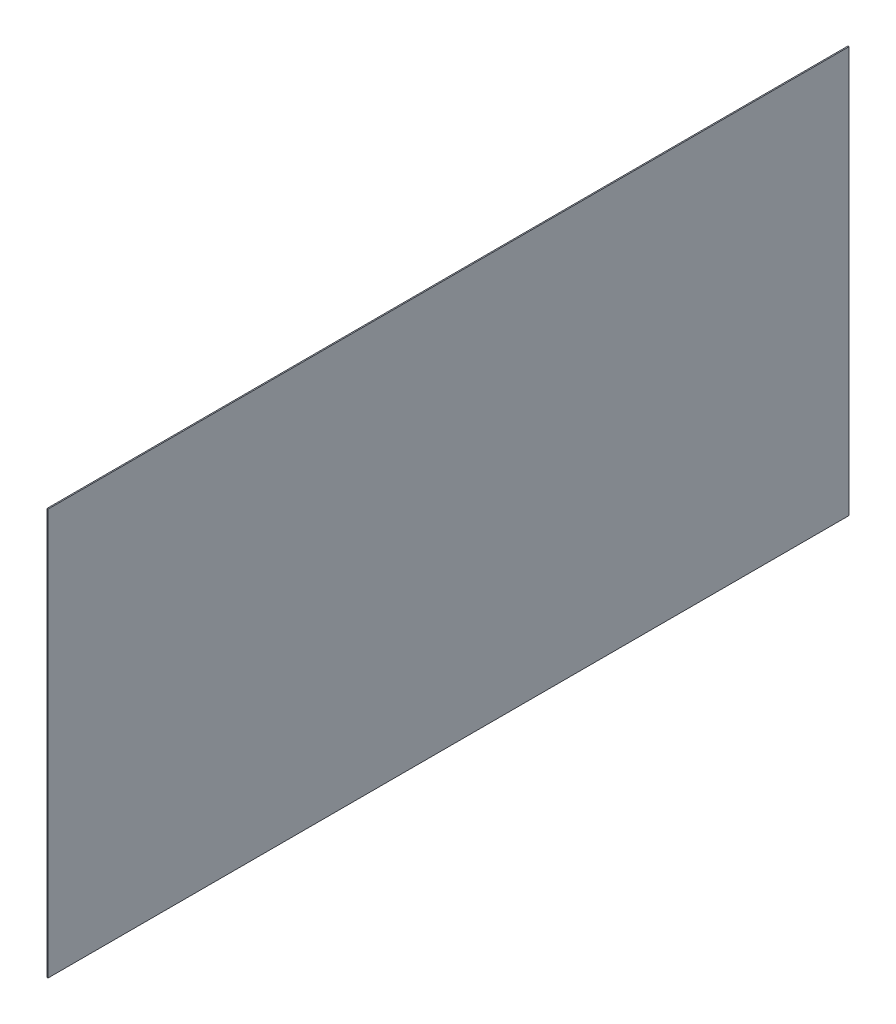
ISO-10303-21;
HEADER;
FILE_DESCRIPTION(('STEP AP214'),'2;1');
FILE_NAME('part.step','',(''),(''),'','','');
FILE_SCHEMA(('AUTOMOTIVE_DESIGN { 1 0 10303 214 1 1 1 1 }'));
ENDSEC;
DATA;
#1=APPLICATION_CONTEXT('core data for automotive mechanical design processes');
#2=APPLICATION_PROTOCOL_DEFINITION('international standard','automotive_design',2000,#1);
#3=PRODUCT_CONTEXT('',#1,'mechanical');
#4=PRODUCT('Part','Part','',(#3));
#5=PRODUCT_RELATED_PRODUCT_CATEGORY('part','',(#4));
#6=PRODUCT_DEFINITION_FORMATION('','',#4);
#7=PRODUCT_DEFINITION_CONTEXT('part definition',#1,'design');
#8=PRODUCT_DEFINITION('design','',#6,#7);
#9=PRODUCT_DEFINITION_SHAPE('','',#8);
#10=(LENGTH_UNIT() NAMED_UNIT(*) SI_UNIT(.MILLI.,.METRE.));
#11=(NAMED_UNIT(*) PLANE_ANGLE_UNIT() SI_UNIT($,.RADIAN.));
#12=(NAMED_UNIT(*) SI_UNIT($,.STERADIAN.) SOLID_ANGLE_UNIT());
#13=UNCERTAINTY_MEASURE_WITH_UNIT(LENGTH_MEASURE(1.E-05),#10,'distance_accuracy_value','');
#14=(GEOMETRIC_REPRESENTATION_CONTEXT(3) GLOBAL_UNCERTAINTY_ASSIGNED_CONTEXT((#13)) GLOBAL_UNIT_ASSIGNED_CONTEXT((#10,
#11,#12)) REPRESENTATION_CONTEXT('',''));
#15=CARTESIAN_POINT('',(0.,0.,0.));
#16=DIRECTION('',(0.,0.,1.));
#17=DIRECTION('',(1.,0.,0.));
#18=AXIS2_PLACEMENT_3D('',#15,#16,#17);
#19=CARTESIAN_POINT('',(-125.2,-60.,150.));
#20=DIRECTION('',(0.,-1.,0.));
#21=DIRECTION('',(0.,0.,-1.));
#22=AXIS2_PLACEMENT_3D('',#19,#20,#21);
#23=PLANE('',#22);
#24=DIRECTION('',(1.,0.,0.));
#25=VECTOR('',#24,1.);
#26=CARTESIAN_POINT('',(-135.,-60.,-71.));
#27=LINE('',#26,#25);
#28=CARTESIAN_POINT('',(-125.2,-60.,-71.));
#29=VERTEX_POINT('',#28);
#30=CARTESIAN_POINT('',(-125.,-60.,-71.));
#31=VERTEX_POINT('',#30);
#32=EDGE_CURVE('E68',#29,#31,#27,.T.);
#33=ORIENTED_EDGE('',*,*,#32,.T.);
#34=DIRECTION('',(0.,0.,-1.));
#35=VECTOR('',#34,1.);
#36=CARTESIAN_POINT('',(-125.,-60.,150.));
#37=LINE('',#36,#35);
#38=CARTESIAN_POINT('',(-125.,-60.,71.));
#39=VERTEX_POINT('',#38);
#40=EDGE_CURVE('E48',#39,#31,#37,.T.);
#41=ORIENTED_EDGE('',*,*,#40,.F.);
#42=DIRECTION('',(1.,0.,0.));
#43=VECTOR('',#42,1.);
#44=CARTESIAN_POINT('',(-135.,-60.,71.));
#45=LINE('',#44,#43);
#46=CARTESIAN_POINT('',(-125.2,-60.,71.));
#47=VERTEX_POINT('',#46);
#48=EDGE_CURVE('E60',#47,#39,#45,.T.);
#49=ORIENTED_EDGE('',*,*,#48,.F.);
#50=DIRECTION('',(0.,0.,-1.));
#51=VECTOR('',#50,1.);
#52=CARTESIAN_POINT('',(-125.2,-60.,150.));
#53=LINE('',#52,#51);
#54=EDGE_CURVE('E11',#47,#29,#53,.T.);
#55=ORIENTED_EDGE('',*,*,#54,.T.);
#56=EDGE_LOOP('',(#33,#41,#49,#55));
#57=FACE_BOUND('',#56,.T.);
#58=ADVANCED_FACE('F45',(#57),#23,.T.);
#59=CARTESIAN_POINT('',(-125.2,0.,0.));
#60=DIRECTION('',(-1.,0.,0.));
#61=DIRECTION('',(0.,0.,1.));
#62=AXIS2_PLACEMENT_3D('',#59,#60,#61);
#63=PLANE('',#62);
#64=DIRECTION('',(0.,1.,0.));
#65=VECTOR('',#64,1.);
#66=CARTESIAN_POINT('',(-125.2,0.,-71.));
#67=LINE('',#66,#65);
#68=CARTESIAN_POINT('',(-125.2,12.,-71.));
#69=VERTEX_POINT('',#68);
#70=EDGE_CURVE('E124',#29,#69,#67,.T.);
#71=ORIENTED_EDGE('',*,*,#70,.F.);
#72=ORIENTED_EDGE('',*,*,#54,.F.);
#73=DIRECTION('',(0.,-1.,0.));
#74=VECTOR('',#73,1.);
#75=CARTESIAN_POINT('',(-125.2,0.,71.));
#76=LINE('',#75,#74);
#77=CARTESIAN_POINT('',(-125.2,12.,71.));
#78=VERTEX_POINT('',#77);
#79=EDGE_CURVE('E115',#78,#47,#76,.T.);
#80=ORIENTED_EDGE('',*,*,#79,.F.);
#81=DIRECTION('',(0.,0.,1.));
#82=VECTOR('',#81,1.);
#83=CARTESIAN_POINT('',(-125.2,12.,0.));
#84=LINE('',#83,#82);
#85=EDGE_CURVE('E94',#69,#78,#84,.T.);
#86=ORIENTED_EDGE('',*,*,#85,.F.);
#87=EDGE_LOOP('',(#71,#72,#80,#86));
#88=FACE_BOUND('',#87,.T.);
#89=ADVANCED_FACE('F130',(#88),#63,.T.);
#90=CARTESIAN_POINT('',(-125.,0.,0.));
#91=DIRECTION('',(-1.,0.,0.));
#92=DIRECTION('',(0.,0.,1.));
#93=AXIS2_PLACEMENT_3D('',#90,#91,#92);
#94=PLANE('',#93);
#95=ORIENTED_EDGE('',*,*,#40,.T.);
#96=DIRECTION('',(0.,-1.,0.));
#97=VECTOR('',#96,1.);
#98=CARTESIAN_POINT('',(-125.,12.,-71.));
#99=LINE('',#98,#97);
#100=CARTESIAN_POINT('',(-125.,12.,-71.));
#101=VERTEX_POINT('',#100);
#102=EDGE_CURVE('E107',#101,#31,#99,.T.);
#103=ORIENTED_EDGE('',*,*,#102,.F.);
#104=DIRECTION('',(0.,0.,-1.));
#105=VECTOR('',#104,1.);
#106=CARTESIAN_POINT('',(-125.,12.,71.));
#107=LINE('',#106,#105);
#108=CARTESIAN_POINT('',(-125.,12.,71.));
#109=VERTEX_POINT('',#108);
#110=EDGE_CURVE('E91',#109,#101,#107,.T.);
#111=ORIENTED_EDGE('',*,*,#110,.F.);
#112=DIRECTION('',(0.,1.,0.));
#113=VECTOR('',#112,1.);
#114=CARTESIAN_POINT('',(-125.,-60.,71.));
#115=LINE('',#114,#113);
#116=EDGE_CURVE('E99',#39,#109,#115,.T.);
#117=ORIENTED_EDGE('',*,*,#116,.F.);
#118=EDGE_LOOP('',(#95,#103,#111,#117));
#119=FACE_BOUND('',#118,.T.);
#120=ADVANCED_FACE('F106',(#119),#94,.F.);
#121=CARTESIAN_POINT('',(-135.,12.,-71.));
#122=DIRECTION('',(0.,0.,1.));
#123=DIRECTION('',(1.,0.,0.));
#124=AXIS2_PLACEMENT_3D('',#121,#122,#123);
#125=PLANE('',#124);
#126=ORIENTED_EDGE('',*,*,#70,.T.);
#127=DIRECTION('',(1.,0.,0.));
#128=VECTOR('',#127,1.);
#129=CARTESIAN_POINT('',(-135.,12.,-71.));
#130=LINE('',#129,#128);
#131=EDGE_CURVE('E97',#69,#101,#130,.T.);
#132=ORIENTED_EDGE('',*,*,#131,.T.);
#133=ORIENTED_EDGE('',*,*,#102,.T.);
#134=ORIENTED_EDGE('',*,*,#32,.F.);
#135=EDGE_LOOP('',(#126,#132,#133,#134));
#136=FACE_BOUND('',#135,.T.);
#137=ADVANCED_FACE('F137',(#136),#125,.F.);
#138=CARTESIAN_POINT('',(-135.,12.,71.));
#139=DIRECTION('',(0.,-1.,0.));
#140=DIRECTION('',(0.,0.,-1.));
#141=AXIS2_PLACEMENT_3D('',#138,#139,#140);
#142=PLANE('',#141);
#143=ORIENTED_EDGE('',*,*,#85,.T.);
#144=DIRECTION('',(1.,0.,0.));
#145=VECTOR('',#144,1.);
#146=CARTESIAN_POINT('',(-135.,12.,71.));
#147=LINE('',#146,#145);
#148=EDGE_CURVE('E87',#78,#109,#147,.T.);
#149=ORIENTED_EDGE('',*,*,#148,.T.);
#150=ORIENTED_EDGE('',*,*,#110,.T.);
#151=ORIENTED_EDGE('',*,*,#131,.F.);
#152=EDGE_LOOP('',(#143,#149,#150,#151));
#153=FACE_BOUND('',#152,.T.);
#154=ADVANCED_FACE('F88',(#153),#142,.F.);
#155=CARTESIAN_POINT('',(-135.,-60.,71.));
#156=DIRECTION('',(0.,0.,-1.));
#157=DIRECTION('',(-1.,0.,0.));
#158=AXIS2_PLACEMENT_3D('',#155,#156,#157);
#159=PLANE('',#158);
#160=ORIENTED_EDGE('',*,*,#79,.T.);
#161=ORIENTED_EDGE('',*,*,#48,.T.);
#162=ORIENTED_EDGE('',*,*,#116,.T.);
#163=ORIENTED_EDGE('',*,*,#148,.F.);
#164=EDGE_LOOP('',(#160,#161,#162,#163));
#165=FACE_BOUND('',#164,.T.);
#166=ADVANCED_FACE('F100',(#165),#159,.F.);
#167=CLOSED_SHELL('',(#58,#89,#120,#137,#154,#166));
#168=MANIFOLD_SOLID_BREP('B2',#167);
#169=ADVANCED_BREP_SHAPE_REPRESENTATION('',(#18,#168),#14);
#170=SHAPE_DEFINITION_REPRESENTATION(#9,#169);
ENDSEC;
END-ISO-10303-21;
